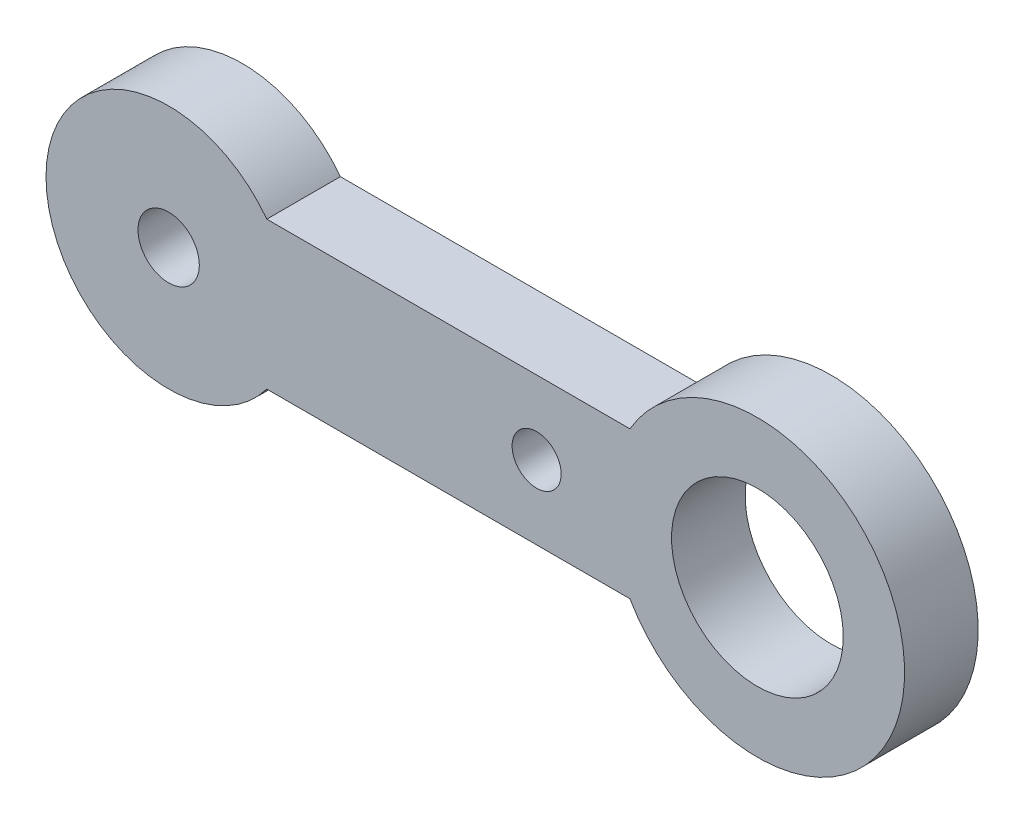
ISO-10303-21;
HEADER;
FILE_DESCRIPTION(('STEP AP214'),'2;1');
FILE_NAME('part.step','',(''),(''),'','','');
FILE_SCHEMA(('AUTOMOTIVE_DESIGN { 1 0 10303 214 1 1 1 1 }'));
ENDSEC;
DATA;
#1=APPLICATION_CONTEXT('core data for automotive mechanical design processes');
#2=APPLICATION_PROTOCOL_DEFINITION('international standard','automotive_design',2000,#1);
#3=PRODUCT_CONTEXT('',#1,'mechanical');
#4=PRODUCT('Part','Part','',(#3));
#5=PRODUCT_RELATED_PRODUCT_CATEGORY('part','',(#4));
#6=PRODUCT_DEFINITION_FORMATION('','',#4);
#7=PRODUCT_DEFINITION_CONTEXT('part definition',#1,'design');
#8=PRODUCT_DEFINITION('design','',#6,#7);
#9=PRODUCT_DEFINITION_SHAPE('','',#8);
#10=(LENGTH_UNIT() NAMED_UNIT(*) SI_UNIT(.MILLI.,.METRE.));
#11=(NAMED_UNIT(*) PLANE_ANGLE_UNIT() SI_UNIT($,.RADIAN.));
#12=(NAMED_UNIT(*) SI_UNIT($,.STERADIAN.) SOLID_ANGLE_UNIT());
#13=UNCERTAINTY_MEASURE_WITH_UNIT(LENGTH_MEASURE(1.E-05),#10,'distance_accuracy_value','');
#14=(GEOMETRIC_REPRESENTATION_CONTEXT(3) GLOBAL_UNCERTAINTY_ASSIGNED_CONTEXT((#13)) GLOBAL_UNIT_ASSIGNED_CONTEXT((#10,
#11,#12)) REPRESENTATION_CONTEXT('',''));
#15=CARTESIAN_POINT('',(0.,0.,0.));
#16=DIRECTION('',(0.,0.,1.));
#17=DIRECTION('',(1.,0.,0.));
#18=AXIS2_PLACEMENT_3D('',#15,#16,#17);
#19=CARTESIAN_POINT('',(-1.30622009569378,0.,3.));
#20=DIRECTION('',(0.,0.,1.));
#21=DIRECTION('',(1.,0.,0.));
#22=AXIS2_PLACEMENT_3D('',#19,#20,#21);
#23=PLANE('',#22);
#24=CARTESIAN_POINT('',(22.6937799043062,0.,3.));
#25=DIRECTION('',(0.,0.,1.));
#26=DIRECTION('',(1.,0.,0.));
#27=AXIS2_PLACEMENT_3D('',#24,#25,#26);
#28=CIRCLE('',#27,3.5);
#29=CARTESIAN_POINT('',(26.1937799043062,0.,3.));
#30=VERTEX_POINT('',#29);
#31=EDGE_CURVE('E115',#30,#30,#28,.T.);
#32=ORIENTED_EDGE('',*,*,#31,.F.);
#33=EDGE_LOOP('',(#32));
#34=FACE_BOUND('',#33,.T.);
#35=CARTESIAN_POINT('',(-1.30622009569378,0.,3.));
#36=DIRECTION('',(0.,0.,1.));
#37=DIRECTION('',(1.,0.,0.));
#38=AXIS2_PLACEMENT_3D('',#35,#36,#37);
#39=CIRCLE('',#38,5.);
#40=CARTESIAN_POINT('',(2.69377990430622,3.,3.));
#41=VERTEX_POINT('',#40);
#42=CARTESIAN_POINT('',(2.69377990430622,-3.,3.));
#43=VERTEX_POINT('',#42);
#44=EDGE_CURVE('E85',#41,#43,#39,.T.);
#45=ORIENTED_EDGE('',*,*,#44,.T.);
#46=DIRECTION('',(1.,0.,0.));
#47=VECTOR('',#46,1.);
#48=CARTESIAN_POINT('',(2.69377990430622,-3.,3.));
#49=LINE('',#48,#47);
#50=CARTESIAN_POINT('',(17.4976274815996,-3.,3.));
#51=VERTEX_POINT('',#50);
#52=EDGE_CURVE('E80',#43,#51,#49,.T.);
#53=ORIENTED_EDGE('',*,*,#52,.T.);
#54=CARTESIAN_POINT('',(22.6937799043062,0.,3.));
#55=DIRECTION('',(0.,0.,1.));
#56=DIRECTION('',(1.,0.,0.));
#57=AXIS2_PLACEMENT_3D('',#54,#55,#56);
#58=CIRCLE('',#57,6.);
#59=CARTESIAN_POINT('',(17.4976274815996,3.,3.));
#60=VERTEX_POINT('',#59);
#61=EDGE_CURVE('E83',#51,#60,#58,.T.);
#62=ORIENTED_EDGE('',*,*,#61,.T.);
#63=DIRECTION('',(-1.,0.,0.));
#64=VECTOR('',#63,1.);
#65=CARTESIAN_POINT('',(2.69377990430622,3.,3.));
#66=LINE('',#65,#64);
#67=EDGE_CURVE('E50',#60,#41,#66,.T.);
#68=ORIENTED_EDGE('',*,*,#67,.T.);
#69=EDGE_LOOP('',(#45,#53,#62,#68));
#70=FACE_BOUND('',#69,.T.);
#71=CARTESIAN_POINT('',(-1.30622009569378,0.,3.));
#72=DIRECTION('',(0.,0.,1.));
#73=DIRECTION('',(1.,0.,0.));
#74=AXIS2_PLACEMENT_3D('',#71,#72,#73);
#75=CIRCLE('',#74,1.25);
#76=CARTESIAN_POINT('',(-0.0562200956937802,0.,3.));
#77=VERTEX_POINT('',#76);
#78=EDGE_CURVE('E100',#77,#77,#75,.T.);
#79=ORIENTED_EDGE('',*,*,#78,.F.);
#80=EDGE_LOOP('',(#79));
#81=FACE_BOUND('',#80,.T.);
#82=CARTESIAN_POINT('',(13.6937799043062,0.,3.));
#83=DIRECTION('',(0.,0.,1.));
#84=DIRECTION('',(1.,0.,0.));
#85=AXIS2_PLACEMENT_3D('',#82,#83,#84);
#86=CIRCLE('',#85,1.);
#87=CARTESIAN_POINT('',(14.6937799043062,0.,3.));
#88=VERTEX_POINT('',#87);
#89=EDGE_CURVE('E121',#88,#88,#86,.T.);
#90=ORIENTED_EDGE('',*,*,#89,.F.);
#91=EDGE_LOOP('',(#90));
#92=FACE_BOUND('',#91,.T.);
#93=ADVANCED_FACE('F33',(#34,#70,#81,#92),#23,.T.);
#94=CARTESIAN_POINT('',(-1.30622009569378,0.,0.));
#95=DIRECTION('',(0.,0.,1.));
#96=DIRECTION('',(1.,0.,0.));
#97=AXIS2_PLACEMENT_3D('',#94,#95,#96);
#98=PLANE('',#97);
#99=CARTESIAN_POINT('',(-1.30622009569378,0.,0.));
#100=DIRECTION('',(0.,0.,1.));
#101=DIRECTION('',(1.,0.,0.));
#102=AXIS2_PLACEMENT_3D('',#99,#100,#101);
#103=CIRCLE('',#102,5.);
#104=CARTESIAN_POINT('',(2.69377990430622,3.,0.));
#105=VERTEX_POINT('',#104);
#106=CARTESIAN_POINT('',(2.69377990430622,-3.,0.));
#107=VERTEX_POINT('',#106);
#108=EDGE_CURVE('E97',#105,#107,#103,.T.);
#109=ORIENTED_EDGE('',*,*,#108,.F.);
#110=DIRECTION('',(-1.,0.,0.));
#111=VECTOR('',#110,1.);
#112=CARTESIAN_POINT('',(2.69377990430622,3.,0.));
#113=LINE('',#112,#111);
#114=CARTESIAN_POINT('',(17.4976274815996,3.,0.));
#115=VERTEX_POINT('',#114);
#116=EDGE_CURVE('E73',#115,#105,#113,.T.);
#117=ORIENTED_EDGE('',*,*,#116,.F.);
#118=CARTESIAN_POINT('',(22.6937799043062,0.,0.));
#119=DIRECTION('',(0.,0.,1.));
#120=DIRECTION('',(1.,0.,0.));
#121=AXIS2_PLACEMENT_3D('',#118,#119,#120);
#122=CIRCLE('',#121,6.);
#123=CARTESIAN_POINT('',(17.4976274815996,-3.,0.));
#124=VERTEX_POINT('',#123);
#125=EDGE_CURVE('E67',#124,#115,#122,.T.);
#126=ORIENTED_EDGE('',*,*,#125,.F.);
#127=DIRECTION('',(1.,0.,0.));
#128=VECTOR('',#127,1.);
#129=CARTESIAN_POINT('',(2.69377990430622,-3.,0.));
#130=LINE('',#129,#128);
#131=EDGE_CURVE('E89',#107,#124,#130,.T.);
#132=ORIENTED_EDGE('',*,*,#131,.F.);
#133=EDGE_LOOP('',(#109,#117,#126,#132));
#134=FACE_BOUND('',#133,.T.);
#135=CARTESIAN_POINT('',(-1.30622009569378,0.,0.));
#136=DIRECTION('',(0.,0.,1.));
#137=DIRECTION('',(1.,0.,0.));
#138=AXIS2_PLACEMENT_3D('',#135,#136,#137);
#139=CIRCLE('',#138,1.25);
#140=CARTESIAN_POINT('',(-0.0562200956937802,0.,0.));
#141=VERTEX_POINT('',#140);
#142=EDGE_CURVE('E112',#141,#141,#139,.T.);
#143=ORIENTED_EDGE('',*,*,#142,.T.);
#144=EDGE_LOOP('',(#143));
#145=FACE_BOUND('',#144,.T.);
#146=CARTESIAN_POINT('',(22.6937799043062,0.,0.));
#147=DIRECTION('',(0.,0.,1.));
#148=DIRECTION('',(1.,0.,0.));
#149=AXIS2_PLACEMENT_3D('',#146,#147,#148);
#150=CIRCLE('',#149,3.5);
#151=CARTESIAN_POINT('',(26.1937799043062,0.,0.));
#152=VERTEX_POINT('',#151);
#153=EDGE_CURVE('E118',#152,#152,#150,.T.);
#154=ORIENTED_EDGE('',*,*,#153,.T.);
#155=EDGE_LOOP('',(#154));
#156=FACE_BOUND('',#155,.T.);
#157=CARTESIAN_POINT('',(13.6937799043062,0.,0.));
#158=DIRECTION('',(0.,0.,1.));
#159=DIRECTION('',(1.,0.,0.));
#160=AXIS2_PLACEMENT_3D('',#157,#158,#159);
#161=CIRCLE('',#160,1.);
#162=CARTESIAN_POINT('',(14.6937799043062,0.,0.));
#163=VERTEX_POINT('',#162);
#164=EDGE_CURVE('E124',#163,#163,#161,.T.);
#165=ORIENTED_EDGE('',*,*,#164,.T.);
#166=EDGE_LOOP('',(#165));
#167=FACE_BOUND('',#166,.T.);
#168=ADVANCED_FACE('F108',(#134,#145,#156,#167),#98,.F.);
#169=CARTESIAN_POINT('',(-1.30622009569378,0.,3.));
#170=DIRECTION('',(0.,0.,-1.));
#171=DIRECTION('',(-1.,0.,0.));
#172=AXIS2_PLACEMENT_3D('',#169,#170,#171);
#173=CYLINDRICAL_SURFACE('',#172,5.);
#174=ORIENTED_EDGE('',*,*,#108,.T.);
#175=DIRECTION('',(0.,0.,-1.));
#176=VECTOR('',#175,1.);
#177=CARTESIAN_POINT('',(2.69377990430622,-3.,3.));
#178=LINE('',#177,#176);
#179=EDGE_CURVE('E11',#43,#107,#178,.T.);
#180=ORIENTED_EDGE('',*,*,#179,.F.);
#181=ORIENTED_EDGE('',*,*,#44,.F.);
#182=DIRECTION('',(0.,0.,-1.));
#183=VECTOR('',#182,1.);
#184=CARTESIAN_POINT('',(2.69377990430622,3.,3.));
#185=LINE('',#184,#183);
#186=EDGE_CURVE('E93',#41,#105,#185,.T.);
#187=ORIENTED_EDGE('',*,*,#186,.T.);
#188=EDGE_LOOP('',(#174,#180,#181,#187));
#189=FACE_BOUND('',#188,.T.);
#190=ADVANCED_FACE('F35',(#189),#173,.T.);
#191=CARTESIAN_POINT('',(2.69377990430622,-3.,3.));
#192=DIRECTION('',(0.,1.,0.));
#193=DIRECTION('',(0.,0.,1.));
#194=AXIS2_PLACEMENT_3D('',#191,#192,#193);
#195=PLANE('',#194);
#196=ORIENTED_EDGE('',*,*,#131,.T.);
#197=DIRECTION('',(0.,0.,-1.));
#198=VECTOR('',#197,1.);
#199=CARTESIAN_POINT('',(17.4976274815996,-3.,3.));
#200=LINE('',#199,#198);
#201=EDGE_CURVE('E42',#51,#124,#200,.T.);
#202=ORIENTED_EDGE('',*,*,#201,.F.);
#203=ORIENTED_EDGE('',*,*,#52,.F.);
#204=ORIENTED_EDGE('',*,*,#179,.T.);
#205=EDGE_LOOP('',(#196,#202,#203,#204));
#206=FACE_BOUND('',#205,.T.);
#207=ADVANCED_FACE('F88',(#206),#195,.F.);
#208=CARTESIAN_POINT('',(22.6937799043062,0.,3.));
#209=DIRECTION('',(0.,0.,-1.));
#210=DIRECTION('',(-1.,0.,0.));
#211=AXIS2_PLACEMENT_3D('',#208,#209,#210);
#212=CYLINDRICAL_SURFACE('',#211,6.);
#213=ORIENTED_EDGE('',*,*,#125,.T.);
#214=DIRECTION('',(0.,0.,-1.));
#215=VECTOR('',#214,1.);
#216=CARTESIAN_POINT('',(17.4976274815996,3.,3.));
#217=LINE('',#216,#215);
#218=EDGE_CURVE('E90',#60,#115,#217,.T.);
#219=ORIENTED_EDGE('',*,*,#218,.F.);
#220=ORIENTED_EDGE('',*,*,#61,.F.);
#221=ORIENTED_EDGE('',*,*,#201,.T.);
#222=EDGE_LOOP('',(#213,#219,#220,#221));
#223=FACE_BOUND('',#222,.T.);
#224=ADVANCED_FACE('F91',(#223),#212,.T.);
#225=CARTESIAN_POINT('',(2.69377990430622,3.,3.));
#226=DIRECTION('',(0.,-1.,0.));
#227=DIRECTION('',(0.,0.,-1.));
#228=AXIS2_PLACEMENT_3D('',#225,#226,#227);
#229=PLANE('',#228);
#230=ORIENTED_EDGE('',*,*,#116,.T.);
#231=ORIENTED_EDGE('',*,*,#186,.F.);
#232=ORIENTED_EDGE('',*,*,#67,.F.);
#233=ORIENTED_EDGE('',*,*,#218,.T.);
#234=EDGE_LOOP('',(#230,#231,#232,#233));
#235=FACE_BOUND('',#234,.T.);
#236=ADVANCED_FACE('F105',(#235),#229,.F.);
#237=CARTESIAN_POINT('',(-1.30622009569378,0.,3.));
#238=DIRECTION('',(0.,0.,-1.));
#239=DIRECTION('',(-1.,0.,0.));
#240=AXIS2_PLACEMENT_3D('',#237,#238,#239);
#241=CYLINDRICAL_SURFACE('',#240,1.25);
#242=ORIENTED_EDGE('',*,*,#78,.T.);
#243=EDGE_LOOP('',(#242));
#244=FACE_BOUND('',#243,.T.);
#245=ORIENTED_EDGE('',*,*,#142,.F.);
#246=EDGE_LOOP('',(#245));
#247=FACE_BOUND('',#246,.T.);
#248=ADVANCED_FACE('F142',(#244,#247),#241,.F.);
#249=CARTESIAN_POINT('',(22.6937799043062,0.,3.));
#250=DIRECTION('',(0.,0.,-1.));
#251=DIRECTION('',(-1.,0.,0.));
#252=AXIS2_PLACEMENT_3D('',#249,#250,#251);
#253=CYLINDRICAL_SURFACE('',#252,3.5);
#254=ORIENTED_EDGE('',*,*,#31,.T.);
#255=EDGE_LOOP('',(#254));
#256=FACE_BOUND('',#255,.T.);
#257=ORIENTED_EDGE('',*,*,#153,.F.);
#258=EDGE_LOOP('',(#257));
#259=FACE_BOUND('',#258,.T.);
#260=ADVANCED_FACE('F188',(#256,#259),#253,.F.);
#261=CARTESIAN_POINT('',(13.6937799043062,0.,3.));
#262=DIRECTION('',(0.,0.,-1.));
#263=DIRECTION('',(-1.,0.,0.));
#264=AXIS2_PLACEMENT_3D('',#261,#262,#263);
#265=CYLINDRICAL_SURFACE('',#264,1.);
#266=ORIENTED_EDGE('',*,*,#89,.T.);
#267=EDGE_LOOP('',(#266));
#268=FACE_BOUND('',#267,.T.);
#269=ORIENTED_EDGE('',*,*,#164,.F.);
#270=EDGE_LOOP('',(#269));
#271=FACE_BOUND('',#270,.T.);
#272=ADVANCED_FACE('F130',(#268,#271),#265,.F.);
#273=CLOSED_SHELL('',(#93,#168,#190,#207,#224,#236,#248,#260,#272));
#274=MANIFOLD_SOLID_BREP('B2',#273);
#275=ADVANCED_BREP_SHAPE_REPRESENTATION('',(#18,#274),#14);
#276=SHAPE_DEFINITION_REPRESENTATION(#9,#275);
ENDSEC;
END-ISO-10303-21;
